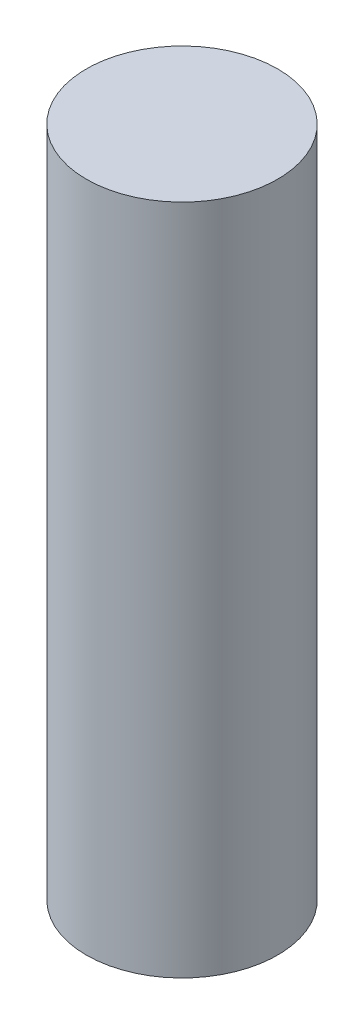
ISO-10303-21;
HEADER;
FILE_DESCRIPTION(('STEP AP214'),'2;1');
FILE_NAME('part.step','',(''),(''),'','','');
FILE_SCHEMA(('AUTOMOTIVE_DESIGN { 1 0 10303 214 1 1 1 1 }'));
ENDSEC;
DATA;
#1=APPLICATION_CONTEXT('core data for automotive mechanical design processes');
#2=APPLICATION_PROTOCOL_DEFINITION('international standard','automotive_design',2000,#1);
#3=PRODUCT_CONTEXT('',#1,'mechanical');
#4=PRODUCT('Part','Part','',(#3));
#5=PRODUCT_RELATED_PRODUCT_CATEGORY('part','',(#4));
#6=PRODUCT_DEFINITION_FORMATION('','',#4);
#7=PRODUCT_DEFINITION_CONTEXT('part definition',#1,'design');
#8=PRODUCT_DEFINITION('design','',#6,#7);
#9=PRODUCT_DEFINITION_SHAPE('','',#8);
#10=(LENGTH_UNIT() NAMED_UNIT(*) SI_UNIT(.MILLI.,.METRE.));
#11=(NAMED_UNIT(*) PLANE_ANGLE_UNIT() SI_UNIT($,.RADIAN.));
#12=(NAMED_UNIT(*) SI_UNIT($,.STERADIAN.) SOLID_ANGLE_UNIT());
#13=UNCERTAINTY_MEASURE_WITH_UNIT(LENGTH_MEASURE(1.E-05),#10,'distance_accuracy_value','');
#14=(GEOMETRIC_REPRESENTATION_CONTEXT(3) GLOBAL_UNCERTAINTY_ASSIGNED_CONTEXT((#13)) GLOBAL_UNIT_ASSIGNED_CONTEXT((#10,
#11,#12)) REPRESENTATION_CONTEXT('',''));
#15=CARTESIAN_POINT('',(0.,0.,0.));
#16=DIRECTION('',(0.,0.,1.));
#17=DIRECTION('',(1.,0.,0.));
#18=AXIS2_PLACEMENT_3D('',#15,#16,#17);
#19=CARTESIAN_POINT('',(0.,13.,0.));
#20=DIRECTION('',(0.,-1.,0.));
#21=DIRECTION('',(0.,0.,-1.));
#22=AXIS2_PLACEMENT_3D('',#19,#20,#21);
#23=CYLINDRICAL_SURFACE('',#22,1.85);
#24=CARTESIAN_POINT('',(0.,13.,0.));
#25=DIRECTION('',(0.,1.,0.));
#26=DIRECTION('',(0.,0.,1.));
#27=AXIS2_PLACEMENT_3D('',#24,#25,#26);
#28=CIRCLE('',#27,1.85);
#29=CARTESIAN_POINT('',(0.,13.,-1.85));
#30=VERTEX_POINT('',#29);
#31=EDGE_CURVE('E10',#30,#30,#28,.T.);
#32=CARTESIAN_POINT('',(0.,0.,0.));
#33=DIRECTION('',(0.,1.,0.));
#34=DIRECTION('',(0.,0.,1.));
#35=AXIS2_PLACEMENT_3D('',#32,#33,#34);
#36=CIRCLE('',#35,1.85);
#37=CARTESIAN_POINT('',(0.,0.,-1.85));
#38=VERTEX_POINT('',#37);
#39=EDGE_CURVE('E46',#38,#38,#36,.T.);
#40=CARTESIAN_POINT('',(0.,13.,-1.85));
#41=CARTESIAN_POINT('',(0.,12.8645833333333,-1.85));
#42=CARTESIAN_POINT('',(0.,12.7291666666667,-1.85));
#43=CARTESIAN_POINT('',(0.,12.4583333333333,-1.85));
#44=CARTESIAN_POINT('',(0.,12.3229166666667,-1.85));
#45=CARTESIAN_POINT('',(0.,12.0520833333333,-1.85));
#46=CARTESIAN_POINT('',(0.,11.9166666666667,-1.85));
#47=CARTESIAN_POINT('',(0.,11.6458333333333,-1.85));
#48=CARTESIAN_POINT('',(0.,11.5104166666667,-1.85));
#49=CARTESIAN_POINT('',(0.,11.2395833333333,-1.85));
#50=CARTESIAN_POINT('',(0.,11.1041666666667,-1.85));
#51=CARTESIAN_POINT('',(0.,10.8333333333333,-1.85));
#52=CARTESIAN_POINT('',(0.,10.6979166666667,-1.85));
#53=CARTESIAN_POINT('',(0.,10.4270833333333,-1.85));
#54=CARTESIAN_POINT('',(0.,10.2916666666667,-1.85));
#55=CARTESIAN_POINT('',(0.,10.0208333333333,-1.85));
#56=CARTESIAN_POINT('',(0.,9.88541666666667,-1.85));
#57=CARTESIAN_POINT('',(0.,9.61458333333333,-1.85));
#58=CARTESIAN_POINT('',(0.,9.47916666666667,-1.85));
#59=CARTESIAN_POINT('',(0.,9.20833333333333,-1.85));
#60=CARTESIAN_POINT('',(0.,9.07291666666666,-1.85));
#61=CARTESIAN_POINT('',(0.,8.80208333333333,-1.85));
#62=CARTESIAN_POINT('',(0.,8.66666666666667,-1.85));
#63=CARTESIAN_POINT('',(0.,8.39583333333333,-1.85));
#64=CARTESIAN_POINT('',(0.,8.26041666666667,-1.85));
#65=CARTESIAN_POINT('',(0.,7.98958333333333,-1.85));
#66=CARTESIAN_POINT('',(0.,7.85416666666667,-1.85));
#67=CARTESIAN_POINT('',(0.,7.58333333333333,-1.85));
#68=CARTESIAN_POINT('',(0.,7.44791666666667,-1.85));
#69=CARTESIAN_POINT('',(0.,7.17708333333333,-1.85));
#70=CARTESIAN_POINT('',(0.,7.04166666666667,-1.85));
#71=CARTESIAN_POINT('',(0.,6.77083333333333,-1.85));
#72=CARTESIAN_POINT('',(0.,6.63541666666667,-1.85));
#73=CARTESIAN_POINT('',(0.,6.36458333333333,-1.85));
#74=CARTESIAN_POINT('',(0.,6.22916666666667,-1.85));
#75=CARTESIAN_POINT('',(0.,5.95833333333333,-1.85));
#76=CARTESIAN_POINT('',(0.,5.82291666666667,-1.85));
#77=CARTESIAN_POINT('',(0.,5.55208333333333,-1.85));
#78=CARTESIAN_POINT('',(0.,5.41666666666667,-1.85));
#79=CARTESIAN_POINT('',(0.,5.14583333333333,-1.85));
#80=CARTESIAN_POINT('',(0.,5.01041666666667,-1.85));
#81=CARTESIAN_POINT('',(0.,4.73958333333333,-1.85));
#82=CARTESIAN_POINT('',(0.,4.60416666666667,-1.85));
#83=CARTESIAN_POINT('',(0.,4.33333333333333,-1.85));
#84=CARTESIAN_POINT('',(0.,4.19791666666667,-1.85));
#85=CARTESIAN_POINT('',(0.,3.92708333333333,-1.85));
#86=CARTESIAN_POINT('',(0.,3.79166666666667,-1.85));
#87=CARTESIAN_POINT('',(0.,3.52083333333333,-1.85));
#88=CARTESIAN_POINT('',(0.,3.38541666666667,-1.85));
#89=CARTESIAN_POINT('',(0.,3.11458333333333,-1.85));
#90=CARTESIAN_POINT('',(0.,2.97916666666667,-1.85));
#91=CARTESIAN_POINT('',(0.,2.70833333333333,-1.85));
#92=CARTESIAN_POINT('',(0.,2.57291666666667,-1.85));
#93=CARTESIAN_POINT('',(0.,2.30208333333333,-1.85));
#94=CARTESIAN_POINT('',(0.,2.16666666666667,-1.85));
#95=CARTESIAN_POINT('',(0.,1.89583333333333,-1.85));
#96=CARTESIAN_POINT('',(0.,1.76041666666667,-1.85));
#97=CARTESIAN_POINT('',(0.,1.48958333333333,-1.85));
#98=CARTESIAN_POINT('',(0.,1.35416666666667,-1.85));
#99=CARTESIAN_POINT('',(0.,1.08333333333333,-1.85));
#100=CARTESIAN_POINT('',(0.,0.947916666666667,-1.85));
#101=CARTESIAN_POINT('',(0.,0.677083333333334,-1.85));
#102=CARTESIAN_POINT('',(0.,0.541666666666667,-1.85));
#103=CARTESIAN_POINT('',(0.,0.270833333333334,-1.85));
#104=CARTESIAN_POINT('',(0.,0.135416666666667,-1.85));
#105=CARTESIAN_POINT('',(0.,0.,-1.85));
#106=B_SPLINE_CURVE_WITH_KNOTS('',3,(#40,#41,#42,#43,#44,#45,#46,#47,#48,#49,#50,#51,#52,#53,
#54,#55,#56,#57,#58,#59,#60,#61,#62,#63,#64,#65,#66,#67,#68,#69,#70,#71,#72,#73,#74,#75,#76,#77,
#78,#79,#80,#81,#82,#83,#84,#85,#86,#87,#88,#89,#90,#91,#92,#93,#94,#95,#96,#97,#98,#99,#100,
#101,#102,#103,#104,#105),.UNSPECIFIED.,.F.,.F.,(4,2,2,2,2,2,2,2,2,2,2,2,2,2,2,2,2,2,2,2,2,2,2,
2,2,2,2,2,2,2,2,2,4),(0.,0.40625,0.812500000000001,1.21875,1.625,2.03125,2.4375,2.84375,3.25,
3.65625,4.0625,4.46875,4.875,5.28125,5.6875,6.09375,6.5,6.90625,7.3125,7.71875,8.125,8.53125,
8.9375,9.34375,9.75,10.15625,10.5625,10.96875,11.375,11.78125,12.1875,12.59375,13.),.UNSPECIFIED.);
#107=EDGE_CURVE('BSEAM43',#30,#38,#106,.T.);
#108=ORIENTED_EDGE('',*,*,#31,.F.);
#109=ORIENTED_EDGE('',*,*,#39,.T.);
#110=ORIENTED_EDGE('',*,*,#107,.T.);
#111=ORIENTED_EDGE('',*,*,#107,.F.);
#112=EDGE_LOOP('',(#108,#110,#109,#111));
#113=FACE_BOUND('',#112,.T.);
#114=ADVANCED_FACE('F43',(#113),#23,.T.);
#115=CARTESIAN_POINT('',(0.,13.,0.));
#116=DIRECTION('',(0.,1.,0.));
#117=DIRECTION('',(0.,0.,1.));
#118=AXIS2_PLACEMENT_3D('',#115,#116,#117);
#119=PLANE('',#118);
#120=ORIENTED_EDGE('',*,*,#31,.T.);
#121=EDGE_LOOP('',(#120));
#122=FACE_BOUND('',#121,.T.);
#123=ADVANCED_FACE('F60',(#122),#119,.T.);
#124=CARTESIAN_POINT('',(0.,0.,0.));
#125=DIRECTION('',(0.,1.,0.));
#126=DIRECTION('',(0.,0.,1.));
#127=AXIS2_PLACEMENT_3D('',#124,#125,#126);
#128=PLANE('',#127);
#129=ORIENTED_EDGE('',*,*,#39,.F.);
#130=EDGE_LOOP('',(#129));
#131=FACE_BOUND('',#130,.T.);
#132=ADVANCED_FACE('F58',(#131),#128,.F.);
#133=CLOSED_SHELL('',(#114,#123,#132));
#134=MANIFOLD_SOLID_BREP('B2',#133);
#135=ADVANCED_BREP_SHAPE_REPRESENTATION('',(#18,#134),#14);
#136=SHAPE_DEFINITION_REPRESENTATION(#9,#135);
ENDSEC;
END-ISO-10303-21;
